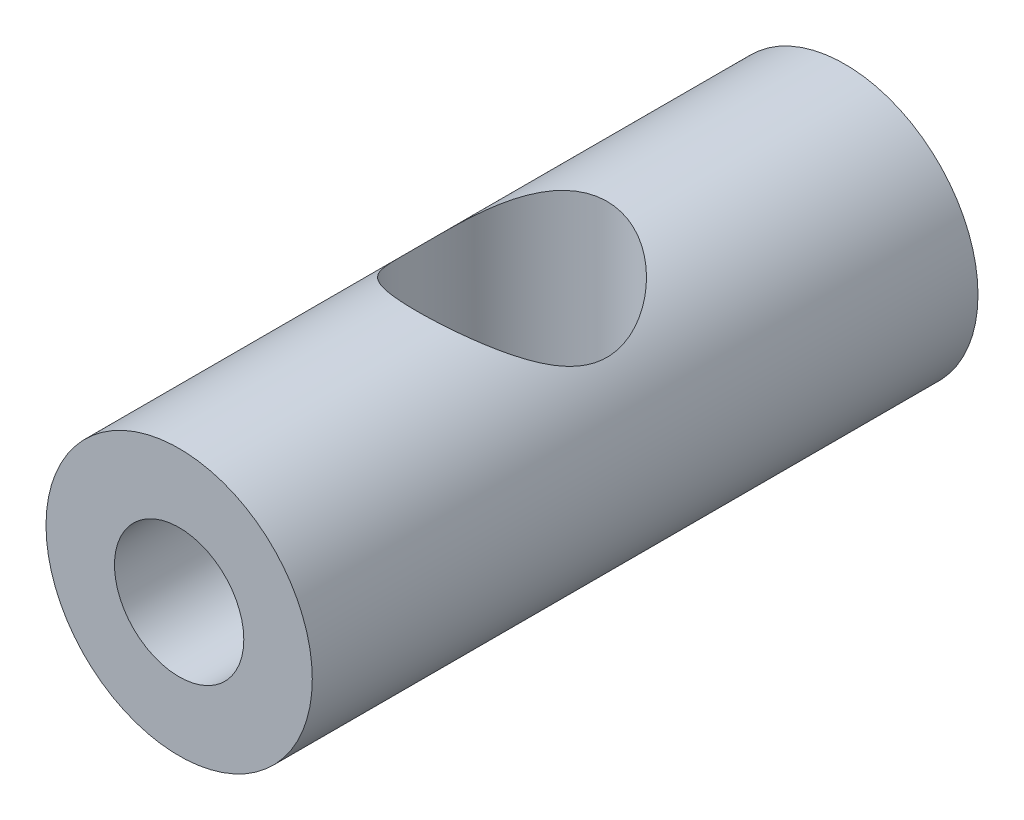
ISO-10303-21;
HEADER;
FILE_DESCRIPTION(('STEP AP214'),'2;1');
FILE_NAME('part.step','',(''),(''),'','','');
FILE_SCHEMA(('AUTOMOTIVE_DESIGN { 1 0 10303 214 1 1 1 1 }'));
ENDSEC;
DATA;
#1=APPLICATION_CONTEXT('core data for automotive mechanical design processes');
#2=APPLICATION_PROTOCOL_DEFINITION('international standard','automotive_design',2000,#1);
#3=PRODUCT_CONTEXT('',#1,'mechanical');
#4=PRODUCT('Part','Part','',(#3));
#5=PRODUCT_RELATED_PRODUCT_CATEGORY('part','',(#4));
#6=PRODUCT_DEFINITION_FORMATION('','',#4);
#7=PRODUCT_DEFINITION_CONTEXT('part definition',#1,'design');
#8=PRODUCT_DEFINITION('design','',#6,#7);
#9=PRODUCT_DEFINITION_SHAPE('','',#8);
#10=(LENGTH_UNIT() NAMED_UNIT(*) SI_UNIT(.MILLI.,.METRE.));
#11=(NAMED_UNIT(*) PLANE_ANGLE_UNIT() SI_UNIT($,.RADIAN.));
#12=(NAMED_UNIT(*) SI_UNIT($,.STERADIAN.) SOLID_ANGLE_UNIT());
#13=UNCERTAINTY_MEASURE_WITH_UNIT(LENGTH_MEASURE(1.E-05),#10,'distance_accuracy_value','');
#14=(GEOMETRIC_REPRESENTATION_CONTEXT(3) GLOBAL_UNCERTAINTY_ASSIGNED_CONTEXT((#13)) GLOBAL_UNIT_ASSIGNED_CONTEXT((#10,
#11,#12)) REPRESENTATION_CONTEXT('',''));
#15=CARTESIAN_POINT('',(0.,0.,0.));
#16=DIRECTION('',(0.,0.,1.));
#17=DIRECTION('',(1.,0.,0.));
#18=AXIS2_PLACEMENT_3D('',#15,#16,#17);
#19=CARTESIAN_POINT('',(0.,0.,17.5));
#20=DIRECTION('',(0.,0.,-1.));
#21=DIRECTION('',(-1.,0.,0.));
#22=AXIS2_PLACEMENT_3D('',#19,#20,#21);
#23=CYLINDRICAL_SURFACE('',#22,7.);
#24=CARTESIAN_POINT('',(0.,-7.,5.));
#25=CARTESIAN_POINT('',(0.123706830347803,-7.00000020838972,5.00000022354689));
#26=CARTESIAN_POINT('',(0.247410973485873,-6.9967139987286,4.99540268236403));
#27=CARTESIAN_POINT('',(0.493842597599125,-6.98364877001323,4.9770866330283));
#28=CARTESIAN_POINT('',(0.616569683621373,-6.97386724806996,4.96336460886491));
#29=CARTESIAN_POINT('',(0.860016934543372,-6.94804684346392,4.92701920398555));
#30=CARTESIAN_POINT('',(0.980737210968061,-6.93200830974386,4.90439631965455));
#31=CARTESIAN_POINT('',(1.21935225441358,-6.89403980063153,4.8505822220875));
#32=CARTESIAN_POINT('',(1.33724577898901,-6.87210728454189,4.81938731360941));
#33=CARTESIAN_POINT('',(1.56876671294682,-6.82296817560751,4.74905518598892));
#34=CARTESIAN_POINT('',(1.68241404829323,-6.79579130680712,4.7099626730664));
#35=CARTESIAN_POINT('',(1.90554075562293,-6.73663568699671,4.62419933209123));
#36=CARTESIAN_POINT('',(2.01501846887803,-6.70465504948953,4.57752552618601));
#37=CARTESIAN_POINT('',(2.33634582627582,-6.60241573373069,4.42689176531504));
#38=CARTESIAN_POINT('',(2.54129209226533,-6.5258150865612,4.31225689851121));
#39=CARTESIAN_POINT('',(2.94722710575678,-6.35349136110254,4.0469663323332));
#40=CARTESIAN_POINT('',(3.14621427453547,-6.25666965742087,3.89400284839666));
#41=CARTESIAN_POINT('',(3.51757946240277,-6.05567589289303,3.56212571592813));
#42=CARTESIAN_POINT('',(3.68991681632733,-5.95149294556457,3.38317320178477));
#43=CARTESIAN_POINT('',(3.9417150806784,-5.78580169781969,3.07967434652797));
#44=CARTESIAN_POINT('',(4.03039974891772,-5.72420876579618,2.96268462237239));
#45=CARTESIAN_POINT('',(4.19756740724372,-5.60277478999017,2.72067323014134));
#46=CARTESIAN_POINT('',(4.2760476158605,-5.54293422728727,2.5956493859919));
#47=CARTESIAN_POINT('',(4.42218280560563,-5.4270606468648,2.33798898871932));
#48=CARTESIAN_POINT('',(4.48985295423517,-5.37102235890232,2.20536346311908));
#49=CARTESIAN_POINT('',(4.61381658166145,-5.2649167619883,1.93265550407132));
#50=CARTESIAN_POINT('',(4.67011181528465,-5.21484853251546,1.79257422505407));
#51=CARTESIAN_POINT('',(4.78838198824486,-5.10685206277554,1.45392718891214));
#52=CARTESIAN_POINT('',(4.84522975768853,-5.0524828289815,1.25231171384458));
#53=CARTESIAN_POINT('',(4.91148095083961,-4.98781463924069,0.942613825930413));
#54=CARTESIAN_POINT('',(4.93038988462307,-4.96907802082194,0.838222893942561));
#55=CARTESIAN_POINT('',(4.96160430011133,-4.93791198912564,0.62753665812238));
#56=CARTESIAN_POINT('',(4.97391239305786,-4.92548008185896,0.521242124562242));
#57=CARTESIAN_POINT('',(4.99174806834479,-4.9074041133857,0.306774863448634));
#58=CARTESIAN_POINT('',(4.99722896284026,-4.90180679564491,0.198594278535289));
#59=CARTESIAN_POINT('',(5.00114067376557,-4.89781588192549,-0.0180268121555076));
#60=CARTESIAN_POINT('',(4.9995717082929,-4.89942206309633,-0.126467309788457));
#61=CARTESIAN_POINT('',(4.9894149735773,-4.9097647058501,-0.342728889399179));
#62=CARTESIAN_POINT('',(4.98082357029426,-4.91850485918776,-0.450549621555853));
#63=CARTESIAN_POINT('',(4.95679292982465,-4.94272114520741,-0.664698469556406));
#64=CARTESIAN_POINT('',(4.94135027570228,-4.9582006389399,-0.771025813267919));
#65=CARTESIAN_POINT('',(4.90151284488867,-4.99760451378594,-0.994825081469287));
#66=CARTESIAN_POINT('',(4.87622911468844,-5.02235272142097,-1.11199391044315));
#67=CARTESIAN_POINT('',(4.81779740683445,-5.07843189223478,-1.34276673574007));
#68=CARTESIAN_POINT('',(4.78464413635863,-5.10976728413097,-1.45636827432982));
#69=CARTESIAN_POINT('',(4.6740034304818,-5.21188277843352,-1.79137244482136));
#70=CARTESIAN_POINT('',(4.58537486342023,-5.29073017996701,-2.0067587698391));
#71=CARTESIAN_POINT('',(4.41699659938633,-5.43117977056448,-2.34795400956389));
#72=CARTESIAN_POINT('',(4.34470821312945,-5.48936415421452,-2.47905841197644));
#73=CARTESIAN_POINT('',(4.18937966154036,-5.60880434984661,-2.73336368670041));
#74=CARTESIAN_POINT('',(4.10633645234857,-5.67006102833911,-2.85656230667667));
#75=CARTESIAN_POINT('',(3.9298928370481,-5.793752422172,-3.09482566922711));
#76=CARTESIAN_POINT('',(3.83648396587933,-5.85618806526485,-3.20988363634829));
#77=CARTESIAN_POINT('',(3.63967604580747,-5.98049354239988,-3.43142884548284));
#78=CARTESIAN_POINT('',(3.53627801821644,-6.04236343357916,-3.53791696165918));
#79=CARTESIAN_POINT('',(3.31865566402193,-6.16459711373884,-3.74287189987029));
#80=CARTESIAN_POINT('',(3.20433257193992,-6.22493938999143,-3.84124688182488));
#81=CARTESIAN_POINT('',(2.96607983417464,-6.34192222059401,-4.02806126698584));
#82=CARTESIAN_POINT('',(2.84215153154958,-6.3985632904349,-4.11650205503039));
#83=CARTESIAN_POINT('',(2.58534749281631,-6.50656183204897,-4.282441595));
#84=CARTESIAN_POINT('',(2.45248841807631,-6.55792871427446,-4.35995993066672));
#85=CARTESIAN_POINT('',(2.1782999787835,-6.65402794776657,-4.50321099396806));
#86=CARTESIAN_POINT('',(2.03697382721867,-6.69876279357063,-4.56894815486164));
#87=CARTESIAN_POINT('',(1.78393161589398,-6.76979900167759,-4.67238732567145));
#88=CARTESIAN_POINT('',(1.67388190691354,-6.79788920127106,-4.71296020505672));
#89=CARTESIAN_POINT('',(1.45016241863132,-6.84910120159546,-4.78653173163408));
#90=CARTESIAN_POINT('',(1.3364934229023,-6.87222406946424,-4.81953200576216));
#91=CARTESIAN_POINT('',(1.10620699746514,-6.91302945246583,-4.87754047313569));
#92=CARTESIAN_POINT('',(0.989590420676744,-6.93071352231445,-4.90255095039585));
#93=CARTESIAN_POINT('',(0.754198086697374,-6.96026202465164,-4.94423541095641));
#94=CARTESIAN_POINT('',(0.635423324765783,-6.97212907243021,-4.96091314066347));
#95=CARTESIAN_POINT('',(0.396096531940574,-6.98981803267421,-4.98574292901636));
#96=CARTESIAN_POINT('',(0.275539612785601,-6.99561783247229,-4.99386380215022));
#97=CARTESIAN_POINT('',(0.0340589156116109,-7.00095849009119,-5.00134248653213));
#98=CARTESIAN_POINT('',(-0.0868647118914833,-7.00050163923066,-5.00070350582503));
#99=CARTESIAN_POINT('',(-0.328194873869985,-6.99334434902713,-4.99067905827532));
#100=CARTESIAN_POINT('',(-0.448601256767222,-6.98664219024223,-4.9812911827097));
#101=CARTESIAN_POINT('',(-0.687926838509059,-6.96714954851426,-4.95391409391108));
#102=CARTESIAN_POINT('',(-0.806846064707048,-6.95435917772169,-4.93592503911972));
#103=CARTESIAN_POINT('',(-1.03669034077474,-6.92373169105251,-4.89267642285578));
#104=CARTESIAN_POINT('',(-1.14772530670985,-6.90616594722286,-4.86780680389531));
#105=CARTESIAN_POINT('',(-1.36703042618004,-6.86612520630985,-4.81082965042213));
#106=CARTESIAN_POINT('',(-1.47529966756194,-6.84364861236167,-4.77871976147637));
#107=CARTESIAN_POINT('',(-1.79502091246227,-6.76946421834351,-4.6720751794697));
#108=CARTESIAN_POINT('',(-2.00155706076147,-6.71097815818561,-4.58719279091312));
#109=CARTESIAN_POINT('',(-2.41580133963063,-6.57387491863986,-4.38428228559054));
#110=CARTESIAN_POINT('',(-2.62191172181247,-6.49391167742686,-4.26394370379289));
#111=CARTESIAN_POINT('',(-3.01190946129234,-6.32248637138391,-3.99802088983066));
#112=CARTESIAN_POINT('',(-3.19577940035419,-6.23101540686786,-3.85241708497908));
#113=CARTESIAN_POINT('',(-3.57103500131531,-6.0250635299762,-3.51046418552866));
#114=CARTESIAN_POINT('',(-3.75775754044495,-5.9094144469246,-3.30970030994848));
#115=CARTESIAN_POINT('',(-4.09660125204316,-5.67976360472223,-2.87973003591422));
#116=CARTESIAN_POINT('',(-4.24870396900494,-5.56576275441127,-2.65050856713161));
#117=CARTESIAN_POINT('',(-4.49468870359568,-5.36830225813508,-2.20283415030589));
#118=CARTESIAN_POINT('',(-4.59394222437956,-5.28284827698324,-1.98822765934173));
#119=CARTESIAN_POINT('',(-4.76250754552228,-5.13141345636178,-1.54119845383935));
#120=CARTESIAN_POINT('',(-4.83188268572654,-5.06539151754964,-1.30881467056926));
#121=CARTESIAN_POINT('',(-4.92694108133025,-4.97281140949568,-0.87463559032775));
#122=CARTESIAN_POINT('',(-4.95835553271174,-4.94119323485648,-0.675204805589684));
#123=CARTESIAN_POINT('',(-4.99670946606584,-4.90241792810041,-0.271727661799282));
#124=CARTESIAN_POINT('',(-5.00367623156318,-4.89523352826001,-0.0676867038902323));
#125=CARTESIAN_POINT('',(-4.99264295050726,-4.90648075072078,0.338985086671424));
#126=CARTESIAN_POINT('',(-4.97464121341455,-4.92491410752053,0.541615822908726));
#127=CARTESIAN_POINT('',(-4.9149871096555,-4.98443760917989,0.940022478739683));
#128=CARTESIAN_POINT('',(-4.87329815495586,-5.02556280172843,1.13578729517115));
#129=CARTESIAN_POINT('',(-4.75069025016355,-5.14200261452279,1.58144229450418));
#130=CARTESIAN_POINT('',(-4.66126522644891,-5.22418017553764,1.82719751183545));
#131=CARTESIAN_POINT('',(-4.50210411725644,-5.36059508623753,2.17892594636777));
#132=CARTESIAN_POINT('',(-4.44479567507594,-5.40832357564202,2.29347906606928));
#133=CARTESIAN_POINT('',(-4.32220971449382,-5.50678597491543,2.51688646084673));
#134=CARTESIAN_POINT('',(-4.25693279761429,-5.55751965778047,2.62574116519785));
#135=CARTESIAN_POINT('',(-4.04590690194063,-5.71505652733019,2.9492592128556));
#136=CARTESIAN_POINT('',(-3.88776756391514,-5.82467625637419,3.1547112586295));
#137=CARTESIAN_POINT('',(-3.6279551096738,-5.98735914065858,3.44306381155547));
#138=CARTESIAN_POINT('',(-3.53753675683206,-6.04132015327539,3.53591534986612));
#139=CARTESIAN_POINT('',(-3.34923083939283,-6.14770901514369,3.71476958843104));
#140=CARTESIAN_POINT('',(-3.25134194311757,-6.2001365887339,3.80077106200219));
#141=CARTESIAN_POINT('',(-3.03086404240044,-6.31122907951896,3.97961408278736));
#142=CARTESIAN_POINT('',(-2.90692152521496,-6.36941716980575,4.07109049129995));
#143=CARTESIAN_POINT('',(-2.64956836988844,-6.48069645050252,4.24307934442604));
#144=CARTESIAN_POINT('',(-2.51616205124388,-6.53378994050182,4.32359674262621));
#145=CARTESIAN_POINT('',(-2.24060912964319,-6.63333305417821,4.47260288918066));
#146=CARTESIAN_POINT('',(-2.09847151388446,-6.67978935099169,4.5411037351815));
#147=CARTESIAN_POINT('',(-1.80631427486925,-6.76463878724721,4.66501640104235));
#148=CARTESIAN_POINT('',(-1.65629773671334,-6.80303505370809,4.72043329807615));
#149=CARTESIAN_POINT('',(-1.38331089815878,-6.86305258081175,4.80647655817349));
#150=CARTESIAN_POINT('',(-1.26160961479055,-6.88650604727471,4.83987416056432));
#151=CARTESIAN_POINT('',(-1.0150426318104,-6.92714135495755,4.89752048853468));
#152=CARTESIAN_POINT('',(-0.89017763434985,-6.94432457497392,4.92177122550463));
#153=CARTESIAN_POINT('',(-0.638329109483767,-6.97198481931338,4.96072173678099));
#154=CARTESIAN_POINT('',(-0.511347293416879,-6.98246701467067,4.97542887580563));
#155=CARTESIAN_POINT('',(-0.256242689441558,-6.99647449097442,4.99506788304421));
#156=CARTESIAN_POINT('',(-0.128119903543471,-6.99999978417626,4.99999976847838));
#157=CARTESIAN_POINT('',(0.,-7.,5.));
#158=B_SPLINE_CURVE_WITH_KNOTS('',3,(#24,#25,#26,#27,#28,#29,#30,#31,#32,#33,#34,#35,#36,#37,
#38,#39,#40,#41,#42,#43,#44,#45,#46,#47,#48,#49,#50,#51,#52,#53,#54,#55,#56,#57,#58,#59,#60,#61,
#62,#63,#64,#65,#66,#67,#68,#69,#70,#71,#72,#73,#74,#75,#76,#77,#78,#79,#80,#81,#82,#83,#84,#85,
#86,#87,#88,#89,#90,#91,#92,#93,#94,#95,#96,#97,#98,#99,#100,#101,#102,#103,#104,#105,#106,#107,
#108,#109,#110,#111,#112,#113,#114,#115,#116,#117,#118,#119,#120,#121,#122,#123,#124,#125,#126,
#127,#128,#129,#130,#131,#132,#133,#134,#135,#136,#137,#138,#139,#140,#141,#142,#143,#144,#145,
#146,#147,#148,#149,#150,#151,#152,#153,#154,#155,#156,#157),.UNSPECIFIED.,.T.,.F.,(4,2,2,2,2,2,
2,2,2,2,2,2,2,2,2,2,2,2,2,2,2,2,2,2,2,2,2,2,2,2,2,2,2,2,2,2,2,2,2,2,2,2,2,2,2,2,2,2,2,2,2,2,2,2,
2,2,2,2,2,2,2,2,2,2,2,2,4),(0.,0.370988075311342,0.742119189353149,1.11322960901298,
1.48450025920444,1.85372534219339,2.22309580520344,2.96119440682995,3.76545645669383,
4.57093387736644,5.04808282383801,5.52536155725331,6.00196462889924,6.47849411798937,
7.12486898649108,7.44773292534192,7.77046904731893,8.09540029733772,8.42032149521341,
8.74541094303565,9.07066270584136,9.43729317449982,9.80417093025883,10.5385885670457,
11.0199765172867,11.501501010235,11.9834216722646,12.4652931137676,12.9520296640933,
13.4386982783501,13.9244828884573,14.4100843121038,14.7715471013432,15.1329321592676,
15.4942138166987,15.8553328952545,16.2177635696493,16.5800615177667,16.9424592422916,
17.304850291374,17.6498662512386,17.9949945676154,18.6847309611871,19.4371210061711,
20.190096543024,21.0793568967469,21.9690902023821,22.7207890020039,23.4708863194346,
24.0812720855668,24.690976446486,25.3007220906012,25.9114121377249,26.7290171085949,
27.1388076467791,27.5485672699122,28.3895670350435,28.810455633468,29.2314194343296,
29.724740195124,30.2178372239682,30.7104349429707,31.2028411960805,31.5874461531241,
31.9719664863837,32.356189734384,32.7404123055309),.UNSPECIFIED.);
#159=CARTESIAN_POINT('',(0.,-7.,5.));
#160=VERTEX_POINT('',#159);
#161=EDGE_CURVE('E10',#160,#160,#158,.T.);
#162=ORIENTED_EDGE('',*,*,#161,.T.);
#163=EDGE_LOOP('',(#162));
#164=FACE_BOUND('',#163,.T.);
#165=CARTESIAN_POINT('',(0.,7.,5.));
#166=CARTESIAN_POINT('',(-0.123706830347803,7.00000020838972,5.00000022354689));
#167=CARTESIAN_POINT('',(-0.247410973485874,6.9967139987286,4.99540268236403));
#168=CARTESIAN_POINT('',(-0.493842597599125,6.98364877001323,4.9770866330283));
#169=CARTESIAN_POINT('',(-0.616569683621373,6.97386724806996,4.96336460886491));
#170=CARTESIAN_POINT('',(-0.860016934543372,6.94804684346392,4.92701920398555));
#171=CARTESIAN_POINT('',(-0.980737210968061,6.93200830974386,4.90439631965455));
#172=CARTESIAN_POINT('',(-1.21935225441358,6.89403980063153,4.8505822220875));
#173=CARTESIAN_POINT('',(-1.33724577898901,6.87210728454189,4.81938731360941));
#174=CARTESIAN_POINT('',(-1.56876671294682,6.82296817560751,4.74905518598892));
#175=CARTESIAN_POINT('',(-1.68241404829323,6.79579130680712,4.7099626730664));
#176=CARTESIAN_POINT('',(-1.90554075562293,6.73663568699671,4.62419933209122));
#177=CARTESIAN_POINT('',(-2.01501846887803,6.70465504948953,4.577525526186));
#178=CARTESIAN_POINT('',(-2.33634582627582,6.60241573373069,4.42689176531504));
#179=CARTESIAN_POINT('',(-2.54129209226533,6.5258150865612,4.31225689851121));
#180=CARTESIAN_POINT('',(-2.94722710575678,6.35349136110254,4.04696633233319));
#181=CARTESIAN_POINT('',(-3.14621427453547,6.25666965742087,3.89400284839666));
#182=CARTESIAN_POINT('',(-3.51757946240277,6.05567589289303,3.56212571592813));
#183=CARTESIAN_POINT('',(-3.68991681632733,5.95149294556457,3.38317320178477));
#184=CARTESIAN_POINT('',(-3.9417150806784,5.78580169781969,3.07967434652797));
#185=CARTESIAN_POINT('',(-4.03039974891772,5.72420876579618,2.96268462237239));
#186=CARTESIAN_POINT('',(-4.19756740724372,5.60277478999017,2.72067323014134));
#187=CARTESIAN_POINT('',(-4.2760476158605,5.54293422728727,2.5956493859919));
#188=CARTESIAN_POINT('',(-4.42218280560563,5.4270606468648,2.33798898871932));
#189=CARTESIAN_POINT('',(-4.48985295423517,5.37102235890232,2.20536346311908));
#190=CARTESIAN_POINT('',(-4.61381658166145,5.2649167619883,1.93265550407132));
#191=CARTESIAN_POINT('',(-4.67011181528465,5.21484853251546,1.79257422505407));
#192=CARTESIAN_POINT('',(-4.78838198824486,5.10685206277554,1.45392718891214));
#193=CARTESIAN_POINT('',(-4.84522975768853,5.0524828289815,1.25231171384458));
#194=CARTESIAN_POINT('',(-4.91148095083961,4.98781463924069,0.942613825930412));
#195=CARTESIAN_POINT('',(-4.93038988462307,4.96907802082194,0.838222893942561));
#196=CARTESIAN_POINT('',(-4.96160430011133,4.93791198912564,0.62753665812238));
#197=CARTESIAN_POINT('',(-4.97391239305786,4.92548008185896,0.521242124562242));
#198=CARTESIAN_POINT('',(-4.99174806834479,4.9074041133857,0.306774863448634));
#199=CARTESIAN_POINT('',(-4.99722896284026,4.90180679564491,0.198594278535289));
#200=CARTESIAN_POINT('',(-5.00114067376557,4.89781588192549,-0.0180268121555072));
#201=CARTESIAN_POINT('',(-4.9995717082929,4.89942206309633,-0.126467309788456));
#202=CARTESIAN_POINT('',(-4.9894149735773,4.9097647058501,-0.342728889399179));
#203=CARTESIAN_POINT('',(-4.98082357029426,4.91850485918776,-0.450549621555852));
#204=CARTESIAN_POINT('',(-4.95679292982465,4.94272114520741,-0.664698469556405));
#205=CARTESIAN_POINT('',(-4.94135027570228,4.9582006389399,-0.771025813267919));
#206=CARTESIAN_POINT('',(-4.90151284488867,4.99760451378594,-0.994825081469286));
#207=CARTESIAN_POINT('',(-4.87622911468844,5.02235272142097,-1.11199391044315));
#208=CARTESIAN_POINT('',(-4.81779740683445,5.07843189223478,-1.34276673574007));
#209=CARTESIAN_POINT('',(-4.78464413635863,5.10976728413097,-1.45636827432982));
#210=CARTESIAN_POINT('',(-4.6740034304818,5.21188277843352,-1.79137244482136));
#211=CARTESIAN_POINT('',(-4.58537486342023,5.29073017996701,-2.0067587698391));
#212=CARTESIAN_POINT('',(-4.41699659938633,5.43117977056448,-2.34795400956389));
#213=CARTESIAN_POINT('',(-4.34470821312945,5.48936415421452,-2.47905841197644));
#214=CARTESIAN_POINT('',(-4.18937966154036,5.60880434984661,-2.73336368670041));
#215=CARTESIAN_POINT('',(-4.10633645234857,5.67006102833911,-2.85656230667667));
#216=CARTESIAN_POINT('',(-3.9298928370481,5.793752422172,-3.09482566922711));
#217=CARTESIAN_POINT('',(-3.83648396587933,5.85618806526485,-3.20988363634829));
#218=CARTESIAN_POINT('',(-3.63967604580747,5.98049354239988,-3.43142884548284));
#219=CARTESIAN_POINT('',(-3.53627801821644,6.04236343357916,-3.53791696165917));
#220=CARTESIAN_POINT('',(-3.31865566402194,6.16459711373884,-3.74287189987029));
#221=CARTESIAN_POINT('',(-3.20433257193992,6.22493938999143,-3.84124688182488));
#222=CARTESIAN_POINT('',(-2.96607983417464,6.34192222059401,-4.02806126698584));
#223=CARTESIAN_POINT('',(-2.84215153154959,6.3985632904349,-4.11650205503039));
#224=CARTESIAN_POINT('',(-2.58534749281632,6.50656183204897,-4.282441595));
#225=CARTESIAN_POINT('',(-2.45248841807632,6.55792871427446,-4.35995993066672));
#226=CARTESIAN_POINT('',(-2.1782999787835,6.65402794776657,-4.50321099396806));
#227=CARTESIAN_POINT('',(-2.03697382721867,6.69876279357063,-4.56894815486164));
#228=CARTESIAN_POINT('',(-1.78393161589398,6.76979900167759,-4.67238732567145));
#229=CARTESIAN_POINT('',(-1.67388190691355,6.79788920127106,-4.71296020505671));
#230=CARTESIAN_POINT('',(-1.45016241863132,6.84910120159546,-4.78653173163408));
#231=CARTESIAN_POINT('',(-1.3364934229023,6.87222406946424,-4.81953200576216));
#232=CARTESIAN_POINT('',(-1.10620699746514,6.91302945246583,-4.87754047313569));
#233=CARTESIAN_POINT('',(-0.989590420676747,6.93071352231445,-4.90255095039585));
#234=CARTESIAN_POINT('',(-0.754198086697377,6.96026202465164,-4.94423541095641));
#235=CARTESIAN_POINT('',(-0.635423324765786,6.97212907243021,-4.96091314066347));
#236=CARTESIAN_POINT('',(-0.396096531940578,6.98981803267421,-4.98574292901636));
#237=CARTESIAN_POINT('',(-0.275539612785605,6.99561783247229,-4.99386380215022));
#238=CARTESIAN_POINT('',(-0.0340589156116146,7.00095849009119,-5.00134248653213));
#239=CARTESIAN_POINT('',(0.0868647118914802,7.00050163923066,-5.00070350582503));
#240=CARTESIAN_POINT('',(0.328194873869983,6.99334434902713,-4.99067905827532));
#241=CARTESIAN_POINT('',(0.44860125676722,6.98664219024223,-4.9812911827097));
#242=CARTESIAN_POINT('',(0.687926838509057,6.96714954851426,-4.95391409391108));
#243=CARTESIAN_POINT('',(0.806846064707046,6.95435917772169,-4.93592503911972));
#244=CARTESIAN_POINT('',(1.03669034077474,6.92373169105251,-4.89267642285578));
#245=CARTESIAN_POINT('',(1.14772530670986,6.90616594722286,-4.86780680389531));
#246=CARTESIAN_POINT('',(1.36703042618004,6.86612520630985,-4.81082965042213));
#247=CARTESIAN_POINT('',(1.47529966756194,6.84364861236167,-4.77871976147637));
#248=CARTESIAN_POINT('',(1.79502091246227,6.76946421834351,-4.6720751794697));
#249=CARTESIAN_POINT('',(2.00155706076147,6.71097815818561,-4.58719279091312));
#250=CARTESIAN_POINT('',(2.41580133963063,6.57387491863986,-4.38428228559054));
#251=CARTESIAN_POINT('',(2.62191172181247,6.49391167742686,-4.26394370379289));
#252=CARTESIAN_POINT('',(3.01190946129234,6.32248637138391,-3.99802088983066));
#253=CARTESIAN_POINT('',(3.19577940035419,6.23101540686786,-3.85241708497908));
#254=CARTESIAN_POINT('',(3.57103500131531,6.0250635299762,-3.51046418552866));
#255=CARTESIAN_POINT('',(3.75775754044495,5.9094144469246,-3.30970030994848));
#256=CARTESIAN_POINT('',(4.09660125204316,5.67976360472223,-2.87973003591422));
#257=CARTESIAN_POINT('',(4.24870396900494,5.56576275441127,-2.65050856713162));
#258=CARTESIAN_POINT('',(4.49468870359568,5.36830225813508,-2.20283415030589));
#259=CARTESIAN_POINT('',(4.59394222437956,5.28284827698324,-1.98822765934173));
#260=CARTESIAN_POINT('',(4.76250754552228,5.13141345636177,-1.54119845383935));
#261=CARTESIAN_POINT('',(4.83188268572654,5.06539151754964,-1.30881467056926));
#262=CARTESIAN_POINT('',(4.92694108133025,4.97281140949568,-0.874635590327751));
#263=CARTESIAN_POINT('',(4.95835553271174,4.94119323485647,-0.675204805589685));
#264=CARTESIAN_POINT('',(4.99670946606584,4.90241792810041,-0.271727661799284));
#265=CARTESIAN_POINT('',(5.00367623156318,4.89523352826001,-0.067686703890235));
#266=CARTESIAN_POINT('',(4.99264295050726,4.90648075072078,0.33898508667142));
#267=CARTESIAN_POINT('',(4.97464121341455,4.92491410752053,0.541615822908722));
#268=CARTESIAN_POINT('',(4.9149871096555,4.98443760917988,0.940022478739679));
#269=CARTESIAN_POINT('',(4.87329815495586,5.02556280172843,1.13578729517115));
#270=CARTESIAN_POINT('',(4.75069025016355,5.14200261452279,1.58144229450417));
#271=CARTESIAN_POINT('',(4.66126522644891,5.22418017553764,1.82719751183545));
#272=CARTESIAN_POINT('',(4.50210411725644,5.36059508623752,2.17892594636776));
#273=CARTESIAN_POINT('',(4.44479567507594,5.40832357564202,2.29347906606928));
#274=CARTESIAN_POINT('',(4.32220971449382,5.50678597491543,2.51688646084673));
#275=CARTESIAN_POINT('',(4.25693279761429,5.55751965778047,2.62574116519784));
#276=CARTESIAN_POINT('',(4.04590690194063,5.71505652733019,2.94925921285559));
#277=CARTESIAN_POINT('',(3.88776756391515,5.82467625637418,3.15471125862949));
#278=CARTESIAN_POINT('',(3.62795510967381,5.98735914065857,3.44306381155547));
#279=CARTESIAN_POINT('',(3.53753675683206,6.04132015327539,3.53591534986612));
#280=CARTESIAN_POINT('',(3.34923083939283,6.14770901514369,3.71476958843104));
#281=CARTESIAN_POINT('',(3.25134194311758,6.2001365887339,3.80077106200219));
#282=CARTESIAN_POINT('',(3.03086404240045,6.31122907951895,3.97961408278735));
#283=CARTESIAN_POINT('',(2.90692152521496,6.36941716980575,4.07109049129995));
#284=CARTESIAN_POINT('',(2.64956836988844,6.48069645050251,4.24307934442603));
#285=CARTESIAN_POINT('',(2.51616205124389,6.53378994050182,4.32359674262621));
#286=CARTESIAN_POINT('',(2.2406091296432,6.63333305417821,4.47260288918066));
#287=CARTESIAN_POINT('',(2.09847151388446,6.67978935099168,4.5411037351815));
#288=CARTESIAN_POINT('',(1.80631427486925,6.76463878724721,4.66501640104234));
#289=CARTESIAN_POINT('',(1.65629773671335,6.80303505370809,4.72043329807614));
#290=CARTESIAN_POINT('',(1.38331089815879,6.86305258081175,4.80647655817349));
#291=CARTESIAN_POINT('',(1.26160961479056,6.88650604727471,4.83987416056432));
#292=CARTESIAN_POINT('',(1.0150426318104,6.92714135495755,4.89752048853468));
#293=CARTESIAN_POINT('',(0.890177634349853,6.94432457497392,4.92177122550463));
#294=CARTESIAN_POINT('',(0.638329109483766,6.97198481931338,4.96072173678099));
#295=CARTESIAN_POINT('',(0.511347293416876,6.98246701467067,4.97542887580563));
#296=CARTESIAN_POINT('',(0.256242689441554,6.99647449097442,4.99506788304421));
#297=CARTESIAN_POINT('',(0.128119903543469,6.99999978417626,4.99999976847838));
#298=CARTESIAN_POINT('',(0.,7.,5.));
#299=B_SPLINE_CURVE_WITH_KNOTS('',3,(#165,#166,#167,#168,#169,#170,#171,#172,#173,#174,#175,
#176,#177,#178,#179,#180,#181,#182,#183,#184,#185,#186,#187,#188,#189,#190,#191,#192,#193,#194,
#195,#196,#197,#198,#199,#200,#201,#202,#203,#204,#205,#206,#207,#208,#209,#210,#211,#212,#213,
#214,#215,#216,#217,#218,#219,#220,#221,#222,#223,#224,#225,#226,#227,#228,#229,#230,#231,#232,
#233,#234,#235,#236,#237,#238,#239,#240,#241,#242,#243,#244,#245,#246,#247,#248,#249,#250,#251,
#252,#253,#254,#255,#256,#257,#258,#259,#260,#261,#262,#263,#264,#265,#266,#267,#268,#269,#270,
#271,#272,#273,#274,#275,#276,#277,#278,#279,#280,#281,#282,#283,#284,#285,#286,#287,#288,#289,
#290,#291,#292,#293,#294,#295,#296,#297,#298),.UNSPECIFIED.,.T.,.F.,(4,2,2,2,2,2,2,2,2,2,2,2,2,
2,2,2,2,2,2,2,2,2,2,2,2,2,2,2,2,2,2,2,2,2,2,2,2,2,2,2,2,2,2,2,2,2,2,2,2,2,2,2,2,2,2,2,2,2,2,2,2,
2,2,2,2,2,4),(0.,0.370988075311342,0.742119189353149,1.11322960901298,1.48450025920444,
1.85372534219339,2.22309580520344,2.96119440682996,3.76545645669383,4.57093387736644,
5.04808282383801,5.52536155725331,6.00196462889924,6.47849411798938,7.12486898649108,
7.44773292534192,7.77046904731893,8.09540029733772,8.42032149521341,8.74541094303565,
9.07066270584136,9.43729317449982,9.80417093025883,10.5385885670457,11.0199765172867,
11.501501010235,11.9834216722646,12.4652931137676,12.9520296640933,13.4386982783501,
13.9244828884573,14.4100843121038,14.7715471013432,15.1329321592676,15.4942138166987,
15.8553328952545,16.2177635696493,16.5800615177667,16.9424592422916,17.304850291374,
17.6498662512386,17.9949945676154,18.6847309611871,19.4371210061711,20.190096543024,
21.0793568967469,21.9690902023821,22.7207890020039,23.4708863194346,24.0812720855668,
24.690976446486,25.3007220906012,25.9114121377249,26.7290171085949,27.1388076467791,
27.5485672699122,28.3895670350435,28.810455633468,29.2314194343296,29.724740195124,
30.2178372239682,30.7104349429707,31.2028411960805,31.5874461531241,31.9719664863837,
32.356189734384,32.7404123055309),.UNSPECIFIED.);
#300=CARTESIAN_POINT('',(0.,7.,5.));
#301=VERTEX_POINT('',#300);
#302=EDGE_CURVE('E42',#301,#301,#299,.T.);
#303=ORIENTED_EDGE('',*,*,#302,.T.);
#304=EDGE_LOOP('',(#303));
#305=FACE_BOUND('',#304,.T.);
#306=CARTESIAN_POINT('',(0.,0.,17.5));
#307=DIRECTION('',(0.,0.,1.));
#308=DIRECTION('',(1.,0.,0.));
#309=AXIS2_PLACEMENT_3D('',#306,#307,#308);
#310=CIRCLE('',#309,7.);
#311=CARTESIAN_POINT('',(7.,0.,17.5));
#312=VERTEX_POINT('',#311);
#313=EDGE_CURVE('E46',#312,#312,#310,.T.);
#314=ORIENTED_EDGE('',*,*,#313,.F.);
#315=EDGE_LOOP('',(#314));
#316=FACE_BOUND('',#315,.T.);
#317=CARTESIAN_POINT('',(0.,0.,-17.5));
#318=DIRECTION('',(0.,0.,1.));
#319=DIRECTION('',(1.,0.,0.));
#320=AXIS2_PLACEMENT_3D('',#317,#318,#319);
#321=CIRCLE('',#320,7.);
#322=CARTESIAN_POINT('',(7.,0.,-17.5));
#323=VERTEX_POINT('',#322);
#324=EDGE_CURVE('E81',#323,#323,#321,.T.);
#325=ORIENTED_EDGE('',*,*,#324,.T.);
#326=EDGE_LOOP('',(#325));
#327=FACE_BOUND('',#326,.T.);
#328=ADVANCED_FACE('F30',(#164,#305,#316,#327),#23,.T.);
#329=CARTESIAN_POINT('',(0.,0.,17.5));
#330=DIRECTION('',(0.,0.,1.));
#331=DIRECTION('',(1.,0.,0.));
#332=AXIS2_PLACEMENT_3D('',#329,#330,#331);
#333=PLANE('',#332);
#334=CARTESIAN_POINT('',(0.,0.,17.5));
#335=DIRECTION('',(0.,0.,1.));
#336=DIRECTION('',(1.,0.,0.));
#337=AXIS2_PLACEMENT_3D('',#334,#335,#336);
#338=CIRCLE('',#337,3.4);
#339=CARTESIAN_POINT('',(3.4,0.,17.5));
#340=VERTEX_POINT('',#339);
#341=EDGE_CURVE('E84',#340,#340,#338,.T.);
#342=ORIENTED_EDGE('',*,*,#341,.F.);
#343=EDGE_LOOP('',(#342));
#344=FACE_BOUND('',#343,.T.);
#345=ORIENTED_EDGE('',*,*,#313,.T.);
#346=EDGE_LOOP('',(#345));
#347=FACE_BOUND('',#346,.T.);
#348=ADVANCED_FACE('F61',(#344,#347),#333,.T.);
#349=CARTESIAN_POINT('',(0.,0.,-17.5));
#350=DIRECTION('',(0.,0.,1.));
#351=DIRECTION('',(1.,0.,0.));
#352=AXIS2_PLACEMENT_3D('',#349,#350,#351);
#353=PLANE('',#352);
#354=ORIENTED_EDGE('',*,*,#324,.F.);
#355=EDGE_LOOP('',(#354));
#356=FACE_BOUND('',#355,.T.);
#357=ADVANCED_FACE('F58',(#356),#353,.F.);
#358=CARTESIAN_POINT('',(0.,-7.,0.));
#359=DIRECTION('',(0.,1.,0.));
#360=DIRECTION('',(0.,0.,1.));
#361=AXIS2_PLACEMENT_3D('',#358,#359,#360);
#362=CYLINDRICAL_SURFACE('',#361,5.);
#363=CARTESIAN_POINT('',(0.,-3.4,5.));
#364=CARTESIAN_POINT('',(0.170071412933928,-3.39999313671966,4.99999379754221));
#365=CARTESIAN_POINT('',(0.340187628783519,-3.3871628699533,4.99124394726156));
#366=CARTESIAN_POINT('',(0.674986491817606,-3.33663230683821,4.95709368262945));
#367=CARTESIAN_POINT('',(0.839665334131768,-3.29891496714993,4.93168185778301));
#368=CARTESIAN_POINT('',(1.15821624002656,-3.2009673114579,4.86670931431736));
#369=CARTESIAN_POINT('',(1.31213669085729,-3.14084669318219,4.82721757811425));
#370=CARTESIAN_POINT('',(1.60703091690266,-3.00068898486497,4.73721970198923));
#371=CARTESIAN_POINT('',(1.74800322801371,-2.92064964631179,4.68671231865286));
#372=CARTESIAN_POINT('',(2.02674385114573,-2.73545145579277,4.57349505925956));
#373=CARTESIAN_POINT('',(2.16318487204606,-2.6287205418135,4.5101081616381));
#374=CARTESIAN_POINT('',(2.41751348877072,-2.39693390755036,4.3790539229543));
#375=CARTESIAN_POINT('',(2.53537342566426,-2.27185139438897,4.31138040705437));
#376=CARTESIAN_POINT('',(2.70610068741068,-2.06082471782457,4.20505879450574));
#377=CARTESIAN_POINT('',(2.76557447057535,-1.98031212519362,4.16607553068976));
#378=CARTESIAN_POINT('',(2.87748393954549,-1.81387972394593,4.08958263717546));
#379=CARTESIAN_POINT('',(2.92991793521697,-1.72795862408482,4.05207336288054));
#380=CARTESIAN_POINT('',(3.07595665679275,-1.46257974543242,3.94374157557024));
#381=CARTESIAN_POINT('',(3.1586446840846,-1.27508098058068,3.87688828101203));
#382=CARTESIAN_POINT('',(3.27045609202448,-0.940876468116107,3.7825677599955));
#383=CARTESIAN_POINT('',(3.30819867148644,-0.798664407057673,3.74930032111789));
#384=CARTESIAN_POINT('',(3.36509098307079,-0.507936330942948,3.69833051578608));
#385=CARTESIAN_POINT('',(3.38427421660365,-0.359432181601854,3.680600108965));
#386=CARTESIAN_POINT('',(3.40281604059143,-0.0593830370868417,3.6634727474694));
#387=CARTESIAN_POINT('',(3.40208102520501,0.0921729701206485,3.66416235747491));
#388=CARTESIAN_POINT('',(3.3806118785229,0.392674447989055,3.68397189098518));
#389=CARTESIAN_POINT('',(3.35986325556638,0.541617947384167,3.70310516936646));
#390=CARTESIAN_POINT('',(3.30139122412449,0.82503652900545,3.75529267520972));
#391=CARTESIAN_POINT('',(3.26461516414671,0.95986073930238,3.78756416185567));
#392=CARTESIAN_POINT('',(3.17600695109887,1.22151194984309,3.86216699461495));
#393=CARTESIAN_POINT('',(3.12416313171679,1.34833266036689,3.90450613103584));
#394=CARTESIAN_POINT('',(2.97806617290994,1.65287045614081,4.01787197396246));
#395=CARTESIAN_POINT('',(2.87547124091789,1.82515549828391,4.09280361684194));
#396=CARTESIAN_POINT('',(2.64284501014807,2.14827953984474,4.24675188540495));
#397=CARTESIAN_POINT('',(2.51276272518318,2.29907780089679,4.32577589345511));
#398=CARTESIAN_POINT('',(2.22576045104787,2.57805255997314,4.48026750776573));
#399=CARTESIAN_POINT('',(2.0686176787805,2.70602171686111,4.55569836425437));
#400=CARTESIAN_POINT('',(1.73053207774278,2.93370006503913,4.69451577956614));
#401=CARTESIAN_POINT('',(1.54963953838509,3.03346760295401,4.75792711475773));
#402=CARTESIAN_POINT('',(1.21031812251475,3.18141401552473,4.85376052313937));
#403=CARTESIAN_POINT('',(1.05579425092479,3.23612568999768,4.88993590136625));
#404=CARTESIAN_POINT('',(0.737937683786676,3.32303018731648,4.94787512765953));
#405=CARTESIAN_POINT('',(0.574611006170905,3.35523818937019,4.96964868952906));
#406=CARTESIAN_POINT('',(0.24305967954988,3.39542214135992,4.99686599120607));
#407=CARTESIAN_POINT('',(0.0748204234146078,3.40331634761686,5.00225464370477));
#408=CARTESIAN_POINT('',(-0.260662596303332,3.39414366967279,4.99601834150487));
#409=CARTESIAN_POINT('',(-0.427906309848316,3.37707554128235,4.98439253876036));
#410=CARTESIAN_POINT('',(-0.747437638567902,3.32058383889196,4.9462992143931));
#411=CARTESIAN_POINT('',(-0.900047748369173,3.28239642848041,4.92065320949068));
#412=CARTESIAN_POINT('',(-1.19623514421437,3.18642093192921,4.85715830656358));
#413=CARTESIAN_POINT('',(-1.33981076782461,3.12862925084322,4.81930717047773));
#414=CARTESIAN_POINT('',(-1.62662113661425,2.9902298030166,4.73058382723068));
#415=CARTESIAN_POINT('',(-1.76889541573913,2.90815833882135,4.67890793612585));
#416=CARTESIAN_POINT('',(-2.03827658329355,2.72615097348682,4.56800730235859));
#417=CARTESIAN_POINT('',(-2.1653717729659,2.62620143973949,4.50877680902653));
#418=CARTESIAN_POINT('',(-2.42318500327142,2.39235179859474,4.37635912927187));
#419=CARTESIAN_POINT('',(-2.55094438647673,2.25556918317807,4.30249593251157));
#420=CARTESIAN_POINT('',(-2.78281456782194,1.96237053077888,4.15628739672658));
#421=CARTESIAN_POINT('',(-2.88691506711087,1.80594598937343,4.08394273111718));
#422=CARTESIAN_POINT('',(-3.05654923609815,1.49798029868434,3.958163841109));
#423=CARTESIAN_POINT('',(-3.12543640805701,1.3487989330444,3.90349935582682));
#424=CARTESIAN_POINT('',(-3.24178383741315,1.03835560018541,3.80743484176221));
#425=CARTESIAN_POINT('',(-3.28928619471078,0.877118104269507,3.76600879778757));
#426=CARTESIAN_POINT('',(-3.35437905995445,0.572879201200339,3.708063965905));
#427=CARTESIAN_POINT('',(-3.37560309382005,0.431237315844016,3.68857015551483));
#428=CARTESIAN_POINT('',(-3.39992506795482,0.14514641484033,3.66617104186077));
#429=CARTESIAN_POINT('',(-3.40303907301474,0.000700001173137911,3.66325103659319));
#430=CARTESIAN_POINT('',(-3.3909465536332,-0.286635826794677,3.67444337801691));
#431=CARTESIAN_POINT('',(-3.37575045619881,-0.429526080538106,3.68854603086687));
#432=CARTESIAN_POINT('',(-3.32806631877975,-0.710140891229738,3.73161842547704));
#433=CARTESIAN_POINT('',(-3.29555401666083,-0.847857909288611,3.7606090250385));
#434=CARTESIAN_POINT('',(-3.20188962723742,-1.15844119838114,3.84093673857147));
#435=CARTESIAN_POINT('',(-3.1349013554577,-1.32844818101033,3.89645644489005));
#436=CARTESIAN_POINT('',(-2.9768575582616,-1.65255891149135,4.01849162330637));
#437=CARTESIAN_POINT('',(-2.88576575685676,-1.80663819785503,4.08502361197318));
#438=CARTESIAN_POINT('',(-2.6796432731161,-2.10056475788136,4.22317893126136));
#439=CARTESIAN_POINT('',(-2.56416664172378,-2.24006212586728,4.29487790619102));
#440=CARTESIAN_POINT('',(-2.31171566737487,-2.49974500985711,4.435859272984));
#441=CARTESIAN_POINT('',(-2.17473518945097,-2.61992499481933,4.50514096829084));
#442=CARTESIAN_POINT('',(-1.94507457294219,-2.7905777646502,4.60705079049048));
#443=CARTESIAN_POINT('',(-1.8591427446326,-2.84858602720363,4.64248216683704));
#444=CARTESIAN_POINT('',(-1.68133133689359,-2.95701844485621,4.70979259877777));
#445=CARTESIAN_POINT('',(-1.58945476560854,-3.00744639345469,4.74167342912666));
#446=CARTESIAN_POINT('',(-1.40037564974993,-3.10000103770361,4.80091081831998));
#447=CARTESIAN_POINT('',(-1.30318077038826,-3.14213929831448,4.82827367150955));
#448=CARTESIAN_POINT('',(-1.10413786445614,-3.21748466731234,4.8776429251846));
#449=CARTESIAN_POINT('',(-1.00229201282287,-3.25069590121686,4.89965179949851));
#450=CARTESIAN_POINT('',(-0.753822250104333,-3.31876638344046,4.94502974124755));
#451=CARTESIAN_POINT('',(-0.605381156229826,-3.34910884971331,4.96551129815005));
#452=CARTESIAN_POINT('',(-0.304637414212091,-3.38972385251263,4.9929959285727));
#453=CARTESIAN_POINT('',(-0.152336680190556,-3.40000614759014,5.00000555567695));
#454=CARTESIAN_POINT('',(0.,-3.4,5.));
#455=B_SPLINE_CURVE_WITH_KNOTS('',3,(#363,#364,#365,#366,#367,#368,#369,#370,#371,#372,#373,
#374,#375,#376,#377,#378,#379,#380,#381,#382,#383,#384,#385,#386,#387,#388,#389,#390,#391,#392,
#393,#394,#395,#396,#397,#398,#399,#400,#401,#402,#403,#404,#405,#406,#407,#408,#409,#410,#411,
#412,#413,#414,#415,#416,#417,#418,#419,#420,#421,#422,#423,#424,#425,#426,#427,#428,#429,#430,
#431,#432,#433,#434,#435,#436,#437,#438,#439,#440,#441,#442,#443,#444,#445,#446,#447,#448,#449,
#450,#451,#452,#453,#454),.UNSPECIFIED.,.T.,.F.,(4,2,2,2,2,2,2,2,2,2,2,2,2,2,2,2,2,2,2,2,2,2,2,
2,2,2,2,2,2,2,2,2,2,2,2,2,2,2,2,2,2,2,2,2,2,4),(0.,0.509612086753704,1.01957353234679,
1.52707007756964,2.03462393721374,2.58599569043238,3.13818059436469,3.46008923425403,
3.78207502129198,4.42428680379038,4.87512521908832,5.32514830069296,5.77728663163132,
6.22975259754471,6.65848810582837,7.08755645377092,7.72640915389397,8.36645742827395,
9.01205175368869,9.65630045949821,10.1577842965794,10.6589295446876,11.1617578284615,
11.6646111753945,12.140742953508,12.6169620898477,13.1315700100089,13.6465720213541,
14.2478325138809,14.8493542394406,15.3670109381426,15.8836440304181,16.3153469363973,
16.746666834927,17.1777412268631,17.6094212021585,18.1792780810038,18.7499975253677,
19.3322329043585,19.9146346958288,20.2429248238322,20.5710501111201,20.8987143322707,
21.2262268659945,21.6829197659252,22.139390445752),.UNSPECIFIED.);
#456=CARTESIAN_POINT('',(0.,-3.4,5.));
#457=VERTEX_POINT('',#456);
#458=EDGE_CURVE('E34',#457,#457,#455,.T.);
#459=ORIENTED_EDGE('',*,*,#458,.T.);
#460=EDGE_LOOP('',(#459));
#461=FACE_BOUND('',#460,.T.);
#462=ORIENTED_EDGE('',*,*,#302,.F.);
#463=EDGE_LOOP('',(#462));
#464=FACE_BOUND('',#463,.T.);
#465=ORIENTED_EDGE('',*,*,#161,.F.);
#466=EDGE_LOOP('',(#465));
#467=FACE_BOUND('',#466,.T.);
#468=ADVANCED_FACE('F53',(#461,#464,#467),#362,.F.);
#469=CARTESIAN_POINT('',(0.,0.,17.5));
#470=DIRECTION('',(0.,0.,1.));
#471=DIRECTION('',(1.,0.,0.));
#472=AXIS2_PLACEMENT_3D('',#469,#470,#471);
#473=CYLINDRICAL_SURFACE('',#472,3.4);
#474=ORIENTED_EDGE('',*,*,#341,.T.);
#475=EDGE_LOOP('',(#474));
#476=FACE_BOUND('',#475,.T.);
#477=ORIENTED_EDGE('',*,*,#458,.F.);
#478=EDGE_LOOP('',(#477));
#479=FACE_BOUND('',#478,.T.);
#480=ADVANCED_FACE('F57',(#476,#479),#473,.F.);
#481=CLOSED_SHELL('',(#328,#348,#357,#468,#480));
#482=MANIFOLD_SOLID_BREP('B2',#481);
#483=ADVANCED_BREP_SHAPE_REPRESENTATION('',(#18,#482),#14);
#484=SHAPE_DEFINITION_REPRESENTATION(#9,#483);
ENDSEC;
END-ISO-10303-21;
